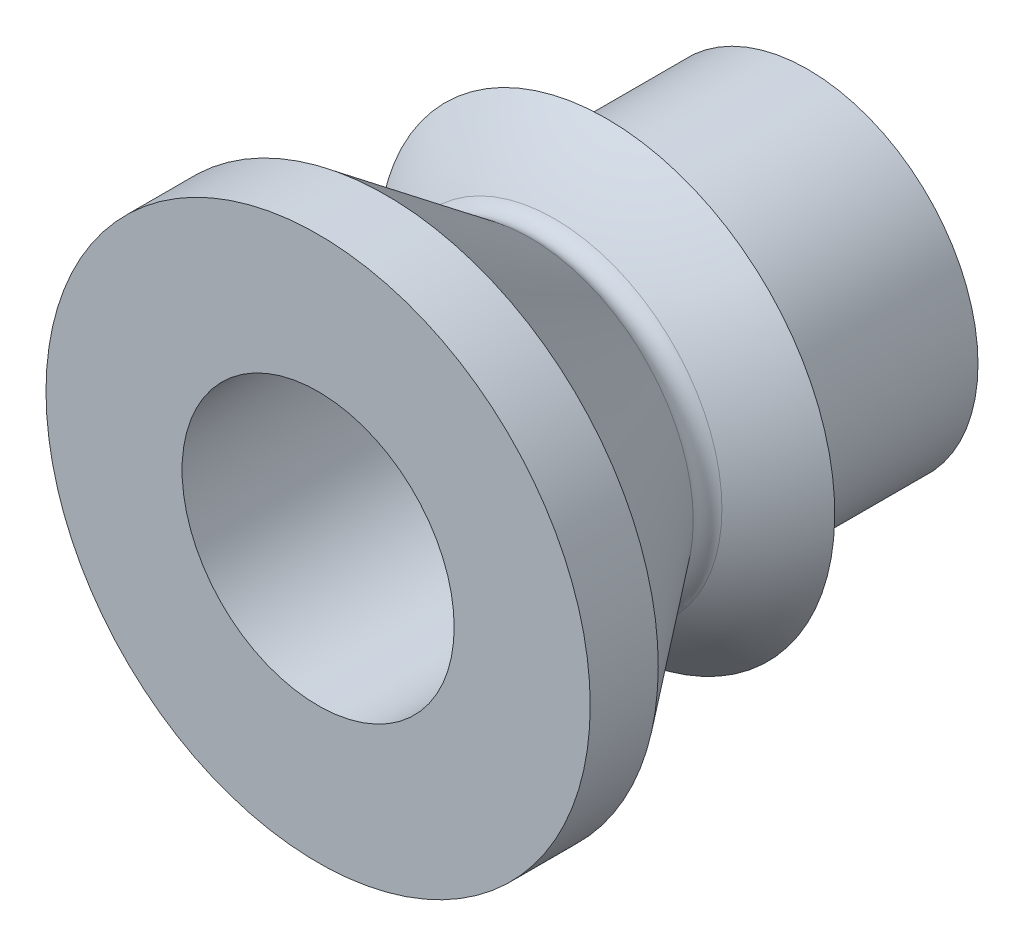
ISO-10303-21;
HEADER;
FILE_DESCRIPTION(('STEP AP214'),'2;1');
FILE_NAME('part.step','',(''),(''),'','','');
FILE_SCHEMA(('AUTOMOTIVE_DESIGN { 1 0 10303 214 1 1 1 1 }'));
ENDSEC;
DATA;
#1=APPLICATION_CONTEXT('core data for automotive mechanical design processes');
#2=APPLICATION_PROTOCOL_DEFINITION('international standard','automotive_design',2000,#1);
#3=PRODUCT_CONTEXT('',#1,'mechanical');
#4=PRODUCT('Part','Part','',(#3));
#5=PRODUCT_RELATED_PRODUCT_CATEGORY('part','',(#4));
#6=PRODUCT_DEFINITION_FORMATION('','',#4);
#7=PRODUCT_DEFINITION_CONTEXT('part definition',#1,'design');
#8=PRODUCT_DEFINITION('design','',#6,#7);
#9=PRODUCT_DEFINITION_SHAPE('','',#8);
#10=(LENGTH_UNIT() NAMED_UNIT(*) SI_UNIT(.MILLI.,.METRE.));
#11=(NAMED_UNIT(*) PLANE_ANGLE_UNIT() SI_UNIT($,.RADIAN.));
#12=(NAMED_UNIT(*) SI_UNIT($,.STERADIAN.) SOLID_ANGLE_UNIT());
#13=UNCERTAINTY_MEASURE_WITH_UNIT(LENGTH_MEASURE(1.E-05),#10,'distance_accuracy_value','');
#14=(GEOMETRIC_REPRESENTATION_CONTEXT(3) GLOBAL_UNCERTAINTY_ASSIGNED_CONTEXT((#13)) GLOBAL_UNIT_ASSIGNED_CONTEXT((#10,
#11,#12)) REPRESENTATION_CONTEXT('',''));
#15=CARTESIAN_POINT('',(0.,0.,0.));
#16=DIRECTION('',(0.,0.,1.));
#17=DIRECTION('',(1.,0.,0.));
#18=AXIS2_PLACEMENT_3D('',#15,#16,#17);
#19=CARTESIAN_POINT('',(0.,0.,47.2757458381693));
#20=DIRECTION('',(0.,0.,1.));
#21=DIRECTION('',(1.,0.,0.));
#22=AXIS2_PLACEMENT_3D('',#19,#20,#21);
#23=CYLINDRICAL_SURFACE('',#22,6.35000000000001);
#24=CARTESIAN_POINT('',(0.,0.,0.127000000000016));
#25=DIRECTION('',(0.,0.,1.));
#26=DIRECTION('',(1.,0.,0.));
#27=AXIS2_PLACEMENT_3D('',#24,#25,#26);
#28=CIRCLE('',#27,6.35000000000003);
#29=CARTESIAN_POINT('',(6.35000000000003,0.,0.127000000000016));
#30=VERTEX_POINT('',#29);
#31=EDGE_CURVE('E60',#30,#30,#28,.T.);
#32=ORIENTED_EDGE('',*,*,#31,.F.);
#33=EDGE_LOOP('',(#32));
#34=FACE_BOUND('',#33,.T.);
#35=CARTESIAN_POINT('',(0.,0.,22.987));
#36=DIRECTION('',(0.,0.,1.));
#37=DIRECTION('',(1.,0.,0.));
#38=AXIS2_PLACEMENT_3D('',#35,#36,#37);
#39=CIRCLE('',#38,6.35);
#40=CARTESIAN_POINT('',(6.35,0.,22.987));
#41=VERTEX_POINT('',#40);
#42=EDGE_CURVE('E10',#41,#41,#39,.T.);
#43=ORIENTED_EDGE('',*,*,#42,.T.);
#44=EDGE_LOOP('',(#43));
#45=FACE_BOUND('',#44,.T.);
#46=ADVANCED_FACE('F29',(#34,#45),#23,.F.);
#47=CARTESIAN_POINT('',(0.,6.35,22.987));
#48=DIRECTION('',(0.,0.,-1.));
#49=DIRECTION('',(-1.,0.,0.));
#50=AXIS2_PLACEMENT_3D('',#47,#48,#49);
#51=PLANE('',#50);
#52=ORIENTED_EDGE('',*,*,#42,.F.);
#53=EDGE_LOOP('',(#52));
#54=FACE_BOUND('',#53,.T.);
#55=CARTESIAN_POINT('',(0.,0.,22.987));
#56=DIRECTION('',(0.,0.,1.));
#57=DIRECTION('',(1.,0.,0.));
#58=AXIS2_PLACEMENT_3D('',#55,#56,#57);
#59=CIRCLE('',#58,12.7);
#60=CARTESIAN_POINT('',(12.7,0.,22.987));
#61=VERTEX_POINT('',#60);
#62=EDGE_CURVE('E35',#61,#61,#59,.T.);
#63=ORIENTED_EDGE('',*,*,#62,.T.);
#64=EDGE_LOOP('',(#63));
#65=FACE_BOUND('',#64,.T.);
#66=ADVANCED_FACE('F67',(#54,#65),#51,.F.);
#67=CARTESIAN_POINT('',(0.,0.,47.2757458381693));
#68=DIRECTION('',(0.,0.,1.));
#69=DIRECTION('',(1.,0.,0.));
#70=AXIS2_PLACEMENT_3D('',#67,#68,#69);
#71=CYLINDRICAL_SURFACE('',#70,12.7);
#72=ORIENTED_EDGE('',*,*,#62,.F.);
#73=EDGE_LOOP('',(#72));
#74=FACE_BOUND('',#73,.T.);
#75=CARTESIAN_POINT('',(0.,0.,19.812));
#76=DIRECTION('',(0.,0.,1.));
#77=DIRECTION('',(1.,0.,0.));
#78=AXIS2_PLACEMENT_3D('',#75,#76,#77);
#79=CIRCLE('',#78,12.7);
#80=CARTESIAN_POINT('',(12.7,0.,19.812));
#81=VERTEX_POINT('',#80);
#82=EDGE_CURVE('E39',#81,#81,#79,.T.);
#83=ORIENTED_EDGE('',*,*,#82,.T.);
#84=EDGE_LOOP('',(#83));
#85=FACE_BOUND('',#84,.T.);
#86=ADVANCED_FACE('F71',(#74,#85),#71,.T.);
#87=CARTESIAN_POINT('',(0.,0.,13.1018889395867));
#88=DIRECTION('',(0.,0.,1.));
#89=DIRECTION('',(1.,0.,0.));
#90=AXIS2_PLACEMENT_3D('',#87,#88,#89);
#91=CONICAL_SURFACE('',#90,7.61999999999998,0.648008322008771);
#92=ORIENTED_EDGE('',*,*,#82,.F.);
#93=EDGE_LOOP('',(#92));
#94=FACE_BOUND('',#93,.T.);
#95=CARTESIAN_POINT('',(0.,0.,13.1018889395867));
#96=DIRECTION('',(0.,0.,1.));
#97=DIRECTION('',(1.,0.,0.));
#98=AXIS2_PLACEMENT_3D('',#95,#96,#97);
#99=CIRCLE('',#98,7.61999999999998);
#100=CARTESIAN_POINT('',(7.61999999999998,0.,13.1018889395867));
#101=VERTEX_POINT('',#100);
#102=EDGE_CURVE('E43',#101,#101,#99,.T.);
#103=ORIENTED_EDGE('',*,*,#102,.T.);
#104=EDGE_LOOP('',(#103));
#105=FACE_BOUND('',#104,.T.);
#106=ADVANCED_FACE('F76',(#94,#105),#91,.T.);
#107=CARTESIAN_POINT('',(0.,0.,12.6227817063796));
#108=DIRECTION('',(0.,0.,1.));
#109=DIRECTION('',(1.,0.,0.));
#110=AXIS2_PLACEMENT_3D('',#107,#108,#109);
#111=TOROIDAL_SURFACE('',#110,8.25284699698162,0.793750000000001);
#112=ORIENTED_EDGE('',*,*,#102,.F.);
#113=EDGE_LOOP('',(#112));
#114=FACE_BOUND('',#113,.T.);
#115=CARTESIAN_POINT('',(0.,0.,11.9584247744649));
#116=DIRECTION('',(0.,0.,1.));
#117=DIRECTION('',(1.,0.,0.));
#118=AXIS2_PLACEMENT_3D('',#115,#116,#117);
#119=CIRCLE('',#118,7.81848662871943);
#120=CARTESIAN_POINT('',(0.,7.81848662871943,11.9584247744649));
#121=VERTEX_POINT('',#120);
#122=EDGE_CURVE('E48',#121,#121,#119,.T.);
#123=ORIENTED_EDGE('',*,*,#122,.T.);
#124=EDGE_LOOP('',(#123));
#125=FACE_BOUND('',#124,.T.);
#126=ADVANCED_FACE('F82',(#114,#125),#111,.F.);
#127=CARTESIAN_POINT('',(0.,0.,0.));
#128=DIRECTION('',(0.,0.,1.));
#129=DIRECTION('',(0.,1.,0.));
#130=AXIS2_PLACEMENT_3D('',#127,#128,#129);
#131=SPHERICAL_SURFACE('',#130,14.2875);
#132=CARTESIAN_POINT('',(0.,0.,9.52500000000001));
#133=DIRECTION('',(0.,0.,1.));
#134=DIRECTION('',(1.,0.,0.));
#135=AXIS2_PLACEMENT_3D('',#132,#133,#134);
#136=CIRCLE('',#135,10.6492737428427);
#137=CARTESIAN_POINT('',(0.,10.6492737428427,9.52500000000001));
#138=VERTEX_POINT('',#137);
#139=EDGE_CURVE('E51',#138,#138,#136,.T.);
#140=CARTESIAN_POINT('',(0.,7.81848662871943,11.9584247744649));
#141=CARTESIAN_POINT('',(0.,7.85112599528718,11.9370849742009));
#142=CARTESIAN_POINT('',(0.,7.88367799028168,11.9156115386624));
#143=CARTESIAN_POINT('',(0.,7.94860506398478,11.8723988508088));
#144=CARTESIAN_POINT('',(0.,7.98098014269338,11.8506595984937));
#145=CARTESIAN_POINT('',(0.,8.04555121068529,11.8069167308595));
#146=CARTESIAN_POINT('',(0.,8.07774719996858,11.7849131155404));
#147=CARTESIAN_POINT('',(0.,8.14195793115609,11.7406429981707));
#148=CARTESIAN_POINT('',(0.,8.1739726730603,11.7183764961201));
#149=CARTESIAN_POINT('',(0.,8.23781876283619,11.6735820979061));
#150=CARTESIAN_POINT('',(0.,8.26965011070788,11.6510542017426));
#151=CARTESIAN_POINT('',(0.,8.33312727828941,11.6057385257897));
#152=CARTESIAN_POINT('',(0.,8.36477309799924,11.5829507460004));
#153=CARTESIAN_POINT('',(0.,8.4278770875056,11.5371168306151));
#154=CARTESIAN_POINT('',(0.,8.45933525730211,11.5140706950192));
#155=CARTESIAN_POINT('',(0.,8.52206183782799,11.4677216131866));
#156=CARTESIAN_POINT('',(0.,8.55333024855735,11.44441866695));
#157=CARTESIAN_POINT('',(0.,8.61567521451335,11.3975575262135));
#158=CARTESIAN_POINT('',(0.,8.64675176973998,11.3739993317136));
#159=CARTESIAN_POINT('',(0.,8.70871094111937,11.3266292739433));
#160=CARTESIAN_POINT('',(0.,8.73959355727212,11.3028174106729));
#161=CARTESIAN_POINT('',(0.,8.80116277993518,11.2549416118613));
#162=CARTESIAN_POINT('',(0.,8.83184938644548,11.2308776763201));
#163=CARTESIAN_POINT('',(0.,8.89302453239691,11.1824993463675));
#164=CARTESIAN_POINT('',(0.,8.92351307183803,11.1581849519561));
#165=CARTESIAN_POINT('',(0.,8.98429003950402,11.1093073344557));
#166=CARTESIAN_POINT('',(0.,9.01457846772889,11.0847441113668));
#167=CARTESIAN_POINT('',(0.,9.07495318223205,11.0353704833875));
#168=CARTESIAN_POINT('',(0.,9.10503946851034,11.010560078497));
#169=CARTESIAN_POINT('',(0.,9.1650078819429,10.960693750363));
#170=CARTESIAN_POINT('',(0.,9.19489000909717,10.9356378271195));
#171=CARTESIAN_POINT('',(0.,9.2544481007924,10.8852821421892));
#172=CARTESIAN_POINT('',(0.,9.28412406533335,10.8599823805023));
#173=CARTESIAN_POINT('',(0.,9.3432678421351,10.8091407149434));
#174=CARTESIAN_POINT('',(0.,9.3727356543959,10.7835988110713));
#175=CARTESIAN_POINT('',(0.,9.43146115092637,10.7322745736349));
#176=CARTESIAN_POINT('',(0.,9.46071883519603,10.7064922400705));
#177=CARTESIAN_POINT('',(0.,9.51902211412159,10.6546888718623));
#178=CARTESIAN_POINT('',(0.,9.54806770877748,10.6286678372185));
#179=CARTESIAN_POINT('',(0.,9.60594486107267,10.5763888114684));
#180=CARTESIAN_POINT('',(0.,9.63477641871198,10.5501308203621));
#181=CARTESIAN_POINT('',(0.,9.69222356392163,10.497379642191));
#182=CARTESIAN_POINT('',(0.,9.72083915149197,10.4708864551261));
#183=CARTESIAN_POINT('',(0.,9.77785243799131,10.417666661311));
#184=CARTESIAN_POINT('',(0.,9.80625013692031,10.3909400545607));
#185=CARTESIAN_POINT('',(0.,9.86282574217324,10.3372552132975));
#186=CARTESIAN_POINT('',(0.,9.89100364849717,10.3102969787847));
#187=CARTESIAN_POINT('',(0.,9.94713777931262,10.2561506894495));
#188=CARTESIAN_POINT('',(0.,9.97509400380414,10.228962634627));
#189=CARTESIAN_POINT('',(0.,10.03078289659,10.1743585275337));
#190=CARTESIAN_POINT('',(0.,10.0585155648844,10.1469424752627));
#191=CARTESIAN_POINT('',(0.,10.1137554859013,10.0918842114213));
#192=CARTESIAN_POINT('',(0.,10.1412627386239,10.0642419998509));
#193=CARTESIAN_POINT('',(0.,10.1960499842302,10.0087332707172));
#194=CARTESIAN_POINT('',(0.,10.223329977114,9.98086675315398));
#195=CARTESIAN_POINT('',(0.,10.2776608740343,9.92491128040044));
#196=CARTESIAN_POINT('',(0.,10.3047117780708,9.8968223252101));
#197=CARTESIAN_POINT('',(0.,10.3585826835665,9.84042386040732));
#198=CARTESIAN_POINT('',(0.,10.3854026850255,9.81211435079487));
#199=CARTESIAN_POINT('',(0.,10.4388099874217,9.75527667541731));
#200=CARTESIAN_POINT('',(0.,10.4653972883588,9.7267485096522));
#201=CARTESIAN_POINT('',(0.,10.5183374062311,9.66947543386485));
#202=CARTESIAN_POINT('',(0.,10.5446902231663,9.64073052384261));
#203=CARTESIAN_POINT('',(0.,10.5971596095204,9.58302588982758));
#204=CARTESIAN_POINT('',(0.,10.6232761789392,9.55406616583479));
#205=CARTESIAN_POINT('',(0.,10.6492737428427,9.52500000000001));
#206=B_SPLINE_CURVE_WITH_KNOTS('',3,(#140,#141,#142,#143,#144,#145,#146,#147,#148,#149,#150,
#151,#152,#153,#154,#155,#156,#157,#158,#159,#160,#161,#162,#163,#164,#165,#166,#167,#168,#169,
#170,#171,#172,#173,#174,#175,#176,#177,#178,#179,#180,#181,#182,#183,#184,#185,#186,#187,#188,
#189,#190,#191,#192,#193,#194,#195,#196,#197,#198,#199,#200,#201,#202,#203,#204,#205),
.UNSPECIFIED.,.F.,.F.,(4,2,2,2,2,2,2,2,2,2,2,2,2,2,2,2,2,2,2,2,2,2,2,2,2,2,2,2,2,2,2,2,4),(0.,
0.1169887235451,0.233977447090201,0.3509661706353,0.467954894180399,0.584943617725502,
0.701932341270602,0.818921064815701,0.9359097883608,1.0528985119059,1.169887235451,
1.2868759589961,1.4038646825412,1.5208534060863,1.6378421296314,1.7548308531765,1.8718195767216,
1.9888083002667,2.1057970238118,2.2227857473569,2.339774470902,2.4567631944471,2.5737519179922,
2.6907406415373,2.8077293650824,2.9247180886275,3.0417068121726,3.1586955357177,
3.27568425926281,3.3926729828079,3.509661706353,3.6266504298981,3.7436391534432),.UNSPECIFIED.);
#207=EDGE_CURVE('BSEAM86',#121,#138,#206,.T.);
#208=ORIENTED_EDGE('',*,*,#122,.F.);
#209=ORIENTED_EDGE('',*,*,#139,.T.);
#210=ORIENTED_EDGE('',*,*,#207,.T.);
#211=ORIENTED_EDGE('',*,*,#207,.F.);
#212=EDGE_LOOP('',(#208,#210,#209,#211));
#213=FACE_BOUND('',#212,.T.);
#214=ADVANCED_FACE('F86',(#213),#131,.T.);
#215=CARTESIAN_POINT('',(0.,7.93750000000002,9.52500000000001));
#216=DIRECTION('',(0.,0.,1.));
#217=DIRECTION('',(1.,0.,0.));
#218=AXIS2_PLACEMENT_3D('',#215,#216,#217);
#219=PLANE('',#218);
#220=ORIENTED_EDGE('',*,*,#139,.F.);
#221=EDGE_LOOP('',(#220));
#222=FACE_BOUND('',#221,.T.);
#223=CARTESIAN_POINT('',(0.,0.,9.52500000000001));
#224=DIRECTION('',(0.,0.,1.));
#225=DIRECTION('',(1.,0.,0.));
#226=AXIS2_PLACEMENT_3D('',#223,#224,#225);
#227=CIRCLE('',#226,7.93750000000002);
#228=CARTESIAN_POINT('',(7.93750000000002,0.,9.52500000000001));
#229=VERTEX_POINT('',#228);
#230=EDGE_CURVE('E54',#229,#229,#227,.T.);
#231=ORIENTED_EDGE('',*,*,#230,.T.);
#232=EDGE_LOOP('',(#231));
#233=FACE_BOUND('',#232,.T.);
#234=ADVANCED_FACE('F90',(#222,#233),#219,.F.);
#235=CARTESIAN_POINT('',(0.,0.,47.2757458381693));
#236=DIRECTION('',(0.,0.,1.));
#237=DIRECTION('',(1.,0.,0.));
#238=AXIS2_PLACEMENT_3D('',#235,#236,#237);
#239=CYLINDRICAL_SURFACE('',#238,7.93750000000003);
#240=ORIENTED_EDGE('',*,*,#230,.F.);
#241=EDGE_LOOP('',(#240));
#242=FACE_BOUND('',#241,.T.);
#243=CARTESIAN_POINT('',(0.,0.,0.127000000000016));
#244=DIRECTION('',(0.,0.,1.));
#245=DIRECTION('',(1.,0.,0.));
#246=AXIS2_PLACEMENT_3D('',#243,#244,#245);
#247=CIRCLE('',#246,7.93750000000003);
#248=CARTESIAN_POINT('',(7.93750000000003,0.,0.127000000000016));
#249=VERTEX_POINT('',#248);
#250=EDGE_CURVE('E57',#249,#249,#247,.T.);
#251=ORIENTED_EDGE('',*,*,#250,.T.);
#252=EDGE_LOOP('',(#251));
#253=FACE_BOUND('',#252,.T.);
#254=ADVANCED_FACE('F94',(#242,#253),#239,.T.);
#255=CARTESIAN_POINT('',(0.,6.35000000000003,0.127000000000013));
#256=DIRECTION('',(0.,0.,1.));
#257=DIRECTION('',(1.,0.,0.));
#258=AXIS2_PLACEMENT_3D('',#255,#256,#257);
#259=PLANE('',#258);
#260=ORIENTED_EDGE('',*,*,#250,.F.);
#261=EDGE_LOOP('',(#260));
#262=FACE_BOUND('',#261,.T.);
#263=ORIENTED_EDGE('',*,*,#31,.T.);
#264=EDGE_LOOP('',(#263));
#265=FACE_BOUND('',#264,.T.);
#266=ADVANCED_FACE('F64',(#262,#265),#259,.F.);
#267=CLOSED_SHELL('',(#46,#66,#86,#106,#126,#214,#234,#254,#266));
#268=MANIFOLD_SOLID_BREP('B2',#267);
#269=ADVANCED_BREP_SHAPE_REPRESENTATION('',(#18,#268),#14);
#270=SHAPE_DEFINITION_REPRESENTATION(#9,#269);
ENDSEC;
END-ISO-10303-21;
